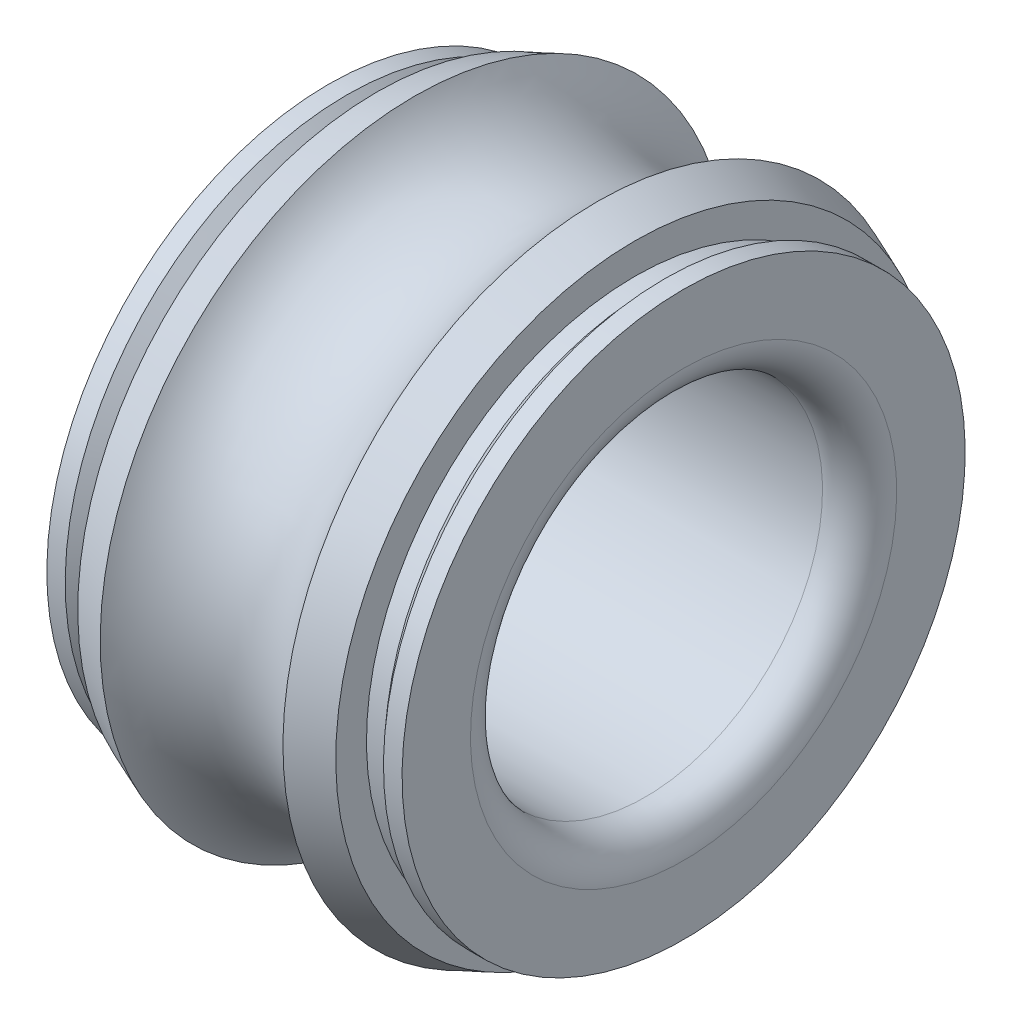
ISO-10303-21;
HEADER;
FILE_DESCRIPTION(('STEP AP214'),'2;1');
FILE_NAME('part.step','',(''),(''),'','','');
FILE_SCHEMA(('AUTOMOTIVE_DESIGN { 1 0 10303 214 1 1 1 1 }'));
ENDSEC;
DATA;
#1=APPLICATION_CONTEXT('core data for automotive mechanical design processes');
#2=APPLICATION_PROTOCOL_DEFINITION('international standard','automotive_design',2000,#1);
#3=PRODUCT_CONTEXT('',#1,'mechanical');
#4=PRODUCT('Part','Part','',(#3));
#5=PRODUCT_RELATED_PRODUCT_CATEGORY('part','',(#4));
#6=PRODUCT_DEFINITION_FORMATION('','',#4);
#7=PRODUCT_DEFINITION_CONTEXT('part definition',#1,'design');
#8=PRODUCT_DEFINITION('design','',#6,#7);
#9=PRODUCT_DEFINITION_SHAPE('','',#8);
#10=(LENGTH_UNIT() NAMED_UNIT(*) SI_UNIT(.MILLI.,.METRE.));
#11=(NAMED_UNIT(*) PLANE_ANGLE_UNIT() SI_UNIT($,.RADIAN.));
#12=(NAMED_UNIT(*) SI_UNIT($,.STERADIAN.) SOLID_ANGLE_UNIT());
#13=UNCERTAINTY_MEASURE_WITH_UNIT(LENGTH_MEASURE(1.E-05),#10,'distance_accuracy_value','');
#14=(GEOMETRIC_REPRESENTATION_CONTEXT(3) GLOBAL_UNCERTAINTY_ASSIGNED_CONTEXT((#13)) GLOBAL_UNIT_ASSIGNED_CONTEXT((#10,
#11,#12)) REPRESENTATION_CONTEXT('',''));
#15=CARTESIAN_POINT('',(0.,0.,0.));
#16=DIRECTION('',(0.,0.,1.));
#17=DIRECTION('',(1.,0.,0.));
#18=AXIS2_PLACEMENT_3D('',#15,#16,#17);
#19=CARTESIAN_POINT('',(2.0012061303941,0.00229086451254343,0.));
#20=DIRECTION('',(0.999999919699005,0.000400751771926105,0.));
#21=DIRECTION('',(-0.000400751771926105,0.999999919699005,0.));
#22=AXIS2_PLACEMENT_3D('',#19,#20,#21);
#23=TOROIDAL_SURFACE('',#22,2.99734814400219,0.500000000000002);
#24=CARTESIAN_POINT('',(2.50120200279558,0.00249123876045439,0.));
#25=DIRECTION('',(0.999999919699005,0.000400751771926105,0.));
#26=DIRECTION('',(-0.000400751771926105,0.999999919699005,0.));
#27=AXIS2_PLACEMENT_3D('',#24,#25,#26);
#28=CIRCLE('',#27,2.99936988375997);
#29=CARTESIAN_POINT('',(2.5,3.00186088166804,0.));
#30=VERTEX_POINT('',#29);
#31=EDGE_CURVE('E10',#30,#30,#28,.T.);
#32=ORIENTED_EDGE('',*,*,#31,.T.);
#33=EDGE_LOOP('',(#32));
#34=FACE_BOUND('',#33,.T.);
#35=CARTESIAN_POINT('',(1.95803340878141,0.00227356296646902,0.));
#36=DIRECTION('',(0.999999919699005,0.000400751771926105,0.));
#37=DIRECTION('',(-0.000400751771926105,0.999999919699005,0.));
#38=AXIS2_PLACEMENT_3D('',#35,#36,#37);
#39=CIRCLE('',#38,2.49921551526842);
#40=CARTESIAN_POINT('',(1.95703184373524,2.5014888775454,0.));
#41=VERTEX_POINT('',#40);
#42=EDGE_CURVE('E104',#41,#41,#39,.T.);
#43=ORIENTED_EDGE('',*,*,#42,.F.);
#44=EDGE_LOOP('',(#43));
#45=FACE_BOUND('',#44,.T.);
#46=ADVANCED_FACE('F37',(#34,#45),#23,.T.);
#47=CARTESIAN_POINT('',(2.50120200279558,0.00249123876045439,0.));
#48=DIRECTION('',(0.999999919699005,0.000400751771926105,0.));
#49=DIRECTION('',(-0.000400751771926105,0.999999919699005,0.));
#50=AXIS2_PLACEMENT_3D('',#47,#48,#49);
#51=CONICAL_SURFACE('',#50,2.99936988375997,1.57039557501224);
#52=CARTESIAN_POINT('',(2.50158800400865,0.00249139345113691,0.));
#53=DIRECTION('',(0.999999919699005,0.000400751771926105,0.));
#54=DIRECTION('',(-0.000400751771926105,0.999999919699005,0.));
#55=AXIS2_PLACEMENT_3D('',#52,#53,#54);
#56=CIRCLE('',#55,3.96256266320082);
#57=CARTESIAN_POINT('',(2.5,3.96505373845423,0.));
#58=VERTEX_POINT('',#57);
#59=EDGE_CURVE('E44',#58,#58,#56,.T.);
#60=ORIENTED_EDGE('',*,*,#59,.T.);
#61=EDGE_LOOP('',(#60));
#62=FACE_BOUND('',#61,.T.);
#63=ORIENTED_EDGE('',*,*,#31,.F.);
#64=EDGE_LOOP('',(#63));
#65=FACE_BOUND('',#64,.T.);
#66=ADVANCED_FACE('F113',(#62,#65),#51,.F.);
#67=CARTESIAN_POINT('',(2.50158800400865,0.00249139345113691,0.));
#68=DIRECTION('',(-0.999999919699005,-0.000400751771926105,0.));
#69=DIRECTION('',(0.000400751771926105,-0.999999919699005,0.));
#70=AXIS2_PLACEMENT_3D('',#67,#68,#69);
#71=CONICAL_SURFACE('',#70,3.96256266320082,0.000400751782648256);
#72=CARTESIAN_POINT('',(2.24002047579692,0.00238656979231029,0.));
#73=DIRECTION('',(0.999999919699005,0.000400751771926105,0.));
#74=DIRECTION('',(-0.000400751771926105,0.999999919699005,0.));
#75=AXIS2_PLACEMENT_3D('',#72,#73,#74);
#76=CIRCLE('',#75,3.96266748686806);
#77=CARTESIAN_POINT('',(2.23843242978001,3.96505373845423,0.));
#78=VERTEX_POINT('',#77);
#79=EDGE_CURVE('E50',#78,#78,#76,.T.);
#80=ORIENTED_EDGE('',*,*,#79,.T.);
#81=EDGE_LOOP('',(#80));
#82=FACE_BOUND('',#81,.T.);
#83=ORIENTED_EDGE('',*,*,#59,.F.);
#84=EDGE_LOOP('',(#83));
#85=FACE_BOUND('',#84,.T.);
#86=ADVANCED_FACE('F117',(#82,#85),#71,.T.);
#87=CARTESIAN_POINT('',(2.24002047579692,0.00238656979231029,0.));
#88=DIRECTION('',(0.999999919699005,0.000400751771926105,0.));
#89=DIRECTION('',(-0.000400751771926105,0.999999919699005,0.));
#90=AXIS2_PLACEMENT_3D('',#87,#88,#89);
#91=CONICAL_SURFACE('',#90,3.96266748686806,0.840613285944387);
#92=CARTESIAN_POINT('',(2.07467902643749,0.00232030890818585,0.));
#93=DIRECTION('',(0.999999919699005,0.000400751771926105,0.));
#94=DIRECTION('',(-0.000400751771926105,0.999999919699005,0.));
#95=AXIS2_PLACEMENT_3D('',#92,#93,#94);
#96=CIRCLE('',#95,3.77797943710241);
#97=CARTESIAN_POINT('',(2.07316499448377,3.78029944263509,0.));
#98=VERTEX_POINT('',#97);
#99=EDGE_CURVE('E55',#98,#98,#96,.T.);
#100=ORIENTED_EDGE('',*,*,#99,.T.);
#101=EDGE_LOOP('',(#100));
#102=FACE_BOUND('',#101,.T.);
#103=ORIENTED_EDGE('',*,*,#79,.F.);
#104=EDGE_LOOP('',(#103));
#105=FACE_BOUND('',#104,.T.);
#106=ADVANCED_FACE('F121',(#102,#105),#91,.T.);
#107=CARTESIAN_POINT('',(2.07467902643749,0.00232030890818585,0.));
#108=DIRECTION('',(-0.999999919699005,-0.000400751771926105,0.));
#109=DIRECTION('',(0.000400751771926105,-0.999999919699005,0.));
#110=AXIS2_PLACEMENT_3D('',#107,#108,#109);
#111=CONICAL_SURFACE('',#110,3.77797943710241,0.000400751782654951);
#112=CARTESIAN_POINT('',(1.81613780415395,0.00221669804691973,0.));
#113=DIRECTION('',(0.999999919699005,0.000400751771926105,0.));
#114=DIRECTION('',(-0.000400751771926105,0.999999919699005,0.));
#115=AXIS2_PLACEMENT_3D('',#112,#113,#114);
#116=CIRCLE('',#115,3.778083047972);
#117=CARTESIAN_POINT('',(1.81462373067799,3.78029944263509,0.));
#118=VERTEX_POINT('',#117);
#119=EDGE_CURVE('E61',#118,#118,#116,.T.);
#120=ORIENTED_EDGE('',*,*,#119,.T.);
#121=EDGE_LOOP('',(#120));
#122=FACE_BOUND('',#121,.T.);
#123=ORIENTED_EDGE('',*,*,#99,.F.);
#124=EDGE_LOOP('',(#123));
#125=FACE_BOUND('',#124,.T.);
#126=ADVANCED_FACE('F128',(#122,#125),#111,.T.);
#127=CARTESIAN_POINT('',(1.81613780415395,0.00221669804691973,0.));
#128=DIRECTION('',(0.999999919699005,0.000400751771926105,0.));
#129=DIRECTION('',(-0.000400751771926105,0.999999919699005,0.));
#130=AXIS2_PLACEMENT_3D('',#127,#128,#129);
#131=CONICAL_SURFACE('',#130,3.778083047972,1.57039557501223);
#132=CARTESIAN_POINT('',(1.81631095809693,0.00221676743867477,0.));
#133=DIRECTION('',(0.999999919699005,0.000400751771926105,0.));
#134=DIRECTION('',(-0.000400751771926105,0.999999919699005,0.));
#135=AXIS2_PLACEMENT_3D('',#132,#133,#134);
#136=CIRCLE('',#135,4.2101558549054);
#137=CARTESIAN_POINT('',(1.81462373067799,4.21237228426437,0.));
#138=VERTEX_POINT('',#137);
#139=EDGE_CURVE('E65',#138,#138,#136,.T.);
#140=ORIENTED_EDGE('',*,*,#139,.T.);
#141=EDGE_LOOP('',(#140));
#142=FACE_BOUND('',#141,.T.);
#143=ORIENTED_EDGE('',*,*,#119,.F.);
#144=EDGE_LOOP('',(#143));
#145=FACE_BOUND('',#144,.T.);
#146=ADVANCED_FACE('F132',(#142,#145),#131,.F.);
#147=CARTESIAN_POINT('',(1.81631095809693,0.00221676743867477,0.));
#148=DIRECTION('',(-0.999999919699005,-0.000400751771926105,0.));
#149=DIRECTION('',(0.000400751771926105,-0.999999919699005,0.));
#150=AXIS2_PLACEMENT_3D('',#147,#148,#149);
#151=CONICAL_SURFACE('',#150,4.2101558549054,0.384415956478727);
#152=CARTESIAN_POINT('',(1.28692066487055,0.00200461332358763,0.));
#153=DIRECTION('',(0.999999919699005,0.000400751771926105,0.));
#154=DIRECTION('',(-0.000400751771926105,0.999999919699005,0.));
#155=AXIS2_PLACEMENT_3D('',#152,#153,#154);
#156=CIRCLE('',#155,4.42431660636691);
#157=CARTESIAN_POINT('',(1.28514761215099,4.42632086441348,0.));
#158=VERTEX_POINT('',#157);
#159=EDGE_CURVE('E69',#158,#158,#156,.T.);
#160=ORIENTED_EDGE('',*,*,#159,.T.);
#161=EDGE_LOOP('',(#160));
#162=FACE_BOUND('',#161,.T.);
#163=ORIENTED_EDGE('',*,*,#139,.F.);
#164=EDGE_LOOP('',(#163));
#165=FACE_BOUND('',#164,.T.);
#166=ADVANCED_FACE('F136',(#162,#165),#151,.T.);
#167=CARTESIAN_POINT('',(0.00208326477285036,0.00148971241751422,0.));
#168=DIRECTION('',(0.999999919699005,0.000400751771926105,0.));
#169=DIRECTION('',(-0.000400751771926105,0.999999919699005,0.));
#170=AXIS2_PLACEMENT_3D('',#167,#168,#169);
#171=TOROIDAL_SURFACE('',#170,5.19839191936122,1.5);
#172=ORIENTED_EDGE('',*,*,#159,.F.);
#173=EDGE_LOOP('',(#172));
#174=FACE_BOUND('',#173,.T.);
#175=CARTESIAN_POINT('',(-1.28337414663692,0.000974563040789473,0.));
#176=DIRECTION('',(0.999999919699005,0.000400751771926105,0.));
#177=DIRECTION('',(-0.000400751771926105,0.999999919699005,0.));
#178=AXIS2_PLACEMENT_3D('',#175,#176,#177);
#179=CIRCLE('',#178,4.42534665673243);
#180=CARTESIAN_POINT('',(-1.28514761215099,4.42632086441348,0.));
#181=VERTEX_POINT('',#180);
#182=EDGE_CURVE('E73',#181,#181,#179,.T.);
#183=ORIENTED_EDGE('',*,*,#182,.T.);
#184=EDGE_LOOP('',(#183));
#185=FACE_BOUND('',#184,.T.);
#186=ADVANCED_FACE('F140',(#174,#185),#171,.F.);
#187=CARTESIAN_POINT('',(-1.8129359203947,0.000762340204570004,0.));
#188=DIRECTION('',(0.999999919699005,0.000400751771926105,0.));
#189=DIRECTION('',(-0.000400751771926105,0.999999919699005,0.));
#190=AXIS2_PLACEMENT_3D('',#187,#188,#189);
#191=CONICAL_SURFACE('',#190,4.2116102822563,0.38361445291344);
#192=ORIENTED_EDGE('',*,*,#182,.F.);
#193=EDGE_LOOP('',(#192));
#194=FACE_BOUND('',#193,.T.);
#195=CARTESIAN_POINT('',(-1.8129359203947,0.000762340204570004,0.));
#196=DIRECTION('',(0.999999919699005,0.000400751771926105,0.));
#197=DIRECTION('',(-0.000400751771926105,0.999999919699005,0.));
#198=AXIS2_PLACEMENT_3D('',#195,#196,#197);
#199=CIRCLE('',#198,4.2116102822563);
#200=CARTESIAN_POINT('',(-1.81462373067798,4.21237228426437,0.));
#201=VERTEX_POINT('',#200);
#202=EDGE_CURVE('E77',#201,#201,#199,.T.);
#203=ORIENTED_EDGE('',*,*,#202,.T.);
#204=EDGE_LOOP('',(#203));
#205=FACE_BOUND('',#204,.T.);
#206=ADVANCED_FACE('F144',(#194,#205),#191,.T.);
#207=CARTESIAN_POINT('',(-1.81310907433769,0.000762270812814965,0.));
#208=DIRECTION('',(0.999999919699005,0.000400751771926105,0.));
#209=DIRECTION('',(-0.000400751771926105,0.999999919699005,0.));
#210=AXIS2_PLACEMENT_3D('',#207,#208,#209);
#211=CONICAL_SURFACE('',#210,3.7795374753229,1.57039557501223);
#212=ORIENTED_EDGE('',*,*,#202,.F.);
#213=EDGE_LOOP('',(#212));
#214=FACE_BOUND('',#213,.T.);
#215=CARTESIAN_POINT('',(-1.81310907433769,0.000762270812814965,0.));
#216=DIRECTION('',(0.999999919699005,0.000400751771926105,0.));
#217=DIRECTION('',(-0.000400751771926105,0.999999919699005,0.));
#218=AXIS2_PLACEMENT_3D('',#215,#216,#217);
#219=CIRCLE('',#218,3.7795374753229);
#220=CARTESIAN_POINT('',(-1.81462373067799,3.78029944263509,0.));
#221=VERTEX_POINT('',#220);
#222=EDGE_CURVE('E81',#221,#221,#219,.T.);
#223=ORIENTED_EDGE('',*,*,#222,.T.);
#224=EDGE_LOOP('',(#223));
#225=FACE_BOUND('',#224,.T.);
#226=ADVANCED_FACE('F148',(#214,#225),#211,.T.);
#227=CARTESIAN_POINT('',(-2.07165029662124,0.000658659951548837,0.));
#228=DIRECTION('',(-0.999999919699005,-0.000400751771926105,0.));
#229=DIRECTION('',(0.000400751771926105,-0.999999919699005,0.));
#230=AXIS2_PLACEMENT_3D('',#227,#228,#229);
#231=CONICAL_SURFACE('',#230,3.77964108619248,0.00040075178264824);
#232=ORIENTED_EDGE('',*,*,#222,.F.);
#233=EDGE_LOOP('',(#232));
#234=FACE_BOUND('',#233,.T.);
#235=CARTESIAN_POINT('',(-2.07165029662124,0.000658659951548837,0.));
#236=DIRECTION('',(0.999999919699005,0.000400751771926105,0.));
#237=DIRECTION('',(-0.000400751771926105,0.999999919699005,0.));
#238=AXIS2_PLACEMENT_3D('',#235,#236,#237);
#239=CIRCLE('',#238,3.77964108619248);
#240=CARTESIAN_POINT('',(-2.07316499448377,3.78029944263509,0.));
#241=VERTEX_POINT('',#240);
#242=EDGE_CURVE('E85',#241,#241,#239,.T.);
#243=ORIENTED_EDGE('',*,*,#242,.T.);
#244=EDGE_LOOP('',(#243));
#245=FACE_BOUND('',#244,.T.);
#246=ADVANCED_FACE('F152',(#234,#245),#231,.T.);
#247=CARTESIAN_POINT('',(-2.23684366476972,0.000592458411236842,0.));
#248=DIRECTION('',(-0.999999919699005,-0.000400751771926105,0.));
#249=DIRECTION('',(0.000400751771926105,-0.999999919699005,0.));
#250=AXIS2_PLACEMENT_3D('',#247,#248,#249);
#251=CONICAL_SURFACE('',#250,3.9644615983932,0.841414789509694);
#252=ORIENTED_EDGE('',*,*,#242,.F.);
#253=EDGE_LOOP('',(#252));
#254=FACE_BOUND('',#253,.T.);
#255=CARTESIAN_POINT('',(-2.23684366476972,0.000592458411236842,0.));
#256=DIRECTION('',(0.999999919699005,0.000400751771926105,0.));
#257=DIRECTION('',(-0.000400751771926105,0.999999919699005,0.));
#258=AXIS2_PLACEMENT_3D('',#255,#256,#257);
#259=CIRCLE('',#258,3.9644615983932);
#260=CARTESIAN_POINT('',(-2.23843242978001,3.96505373845423,0.));
#261=VERTEX_POINT('',#260);
#262=EDGE_CURVE('E89',#261,#261,#259,.T.);
#263=ORIENTED_EDGE('',*,*,#262,.T.);
#264=EDGE_LOOP('',(#263));
#265=FACE_BOUND('',#264,.T.);
#266=ADVANCED_FACE('F156',(#254,#265),#251,.T.);
#267=CARTESIAN_POINT('',(-2.49527353884344,0.000488892172966687,0.));
#268=DIRECTION('',(-0.999999919699005,-0.000400751771926105,0.));
#269=DIRECTION('',(0.000400751771926105,-0.999999919699005,0.));
#270=AXIS2_PLACEMENT_3D('',#267,#268,#269);
#271=CONICAL_SURFACE('',#270,3.96456516463979,0.000400751782649204);
#272=ORIENTED_EDGE('',*,*,#262,.F.);
#273=EDGE_LOOP('',(#272));
#274=FACE_BOUND('',#273,.T.);
#275=CARTESIAN_POINT('',(-2.49527353884344,0.000488892172966687,0.));
#276=DIRECTION('',(0.999999919699005,0.000400751771926105,0.));
#277=DIRECTION('',(-0.000400751771926105,0.999999919699005,0.));
#278=AXIS2_PLACEMENT_3D('',#275,#276,#277);
#279=CIRCLE('',#278,3.96456516463979);
#280=CARTESIAN_POINT('',(-2.49686234535808,3.96505373845423,0.));
#281=VERTEX_POINT('',#280);
#282=EDGE_CURVE('E93',#281,#281,#279,.T.);
#283=ORIENTED_EDGE('',*,*,#282,.T.);
#284=EDGE_LOOP('',(#283));
#285=FACE_BOUND('',#284,.T.);
#286=ADVANCED_FACE('F160',(#274,#285),#271,.T.);
#287=CARTESIAN_POINT('',(-2.49565954005651,0.000488737482284163,0.));
#288=DIRECTION('',(0.999999919699005,0.000400751771926105,0.));
#289=DIRECTION('',(-0.000400751771926105,0.999999919699005,0.));
#290=AXIS2_PLACEMENT_3D('',#287,#288,#289);
#291=CONICAL_SURFACE('',#290,3.00137238519894,1.57039557501224);
#292=ORIENTED_EDGE('',*,*,#282,.F.);
#293=EDGE_LOOP('',(#292));
#294=FACE_BOUND('',#293,.T.);
#295=CARTESIAN_POINT('',(-2.49565954005651,0.000488737482284163,0.));
#296=DIRECTION('',(0.999999919699005,0.000400751771926105,0.));
#297=DIRECTION('',(-0.000400751771926105,0.999999919699005,0.));
#298=AXIS2_PLACEMENT_3D('',#295,#296,#297);
#299=CIRCLE('',#298,3.00137238519894);
#300=CARTESIAN_POINT('',(-2.49686234535808,3.00186088166804,0.));
#301=VERTEX_POINT('',#300);
#302=EDGE_CURVE('E97',#301,#301,#299,.T.);
#303=ORIENTED_EDGE('',*,*,#302,.T.);
#304=EDGE_LOOP('',(#303));
#305=FACE_BOUND('',#304,.T.);
#306=ADVANCED_FACE('F164',(#294,#305),#291,.T.);
#307=CARTESIAN_POINT('',(-1.99565994110063,0.000689113223618313,0.));
#308=DIRECTION('',(0.999999919699005,0.000400751771926105,0.));
#309=DIRECTION('',(-0.000400751771926105,0.999999919699005,0.));
#310=AXIS2_PLACEMENT_3D('',#307,#308,#309);
#311=TOROIDAL_SURFACE('',#310,3.00071697439448,0.500000068669789);
#312=ORIENTED_EDGE('',*,*,#302,.F.);
#313=EDGE_LOOP('',(#312));
#314=FACE_BOUND('',#313,.T.);
#315=CARTESIAN_POINT('',(-1.98674476742788,0.000692685995551722,0.));
#316=DIRECTION('',(0.999999919699005,0.000400751771926105,0.));
#317=DIRECTION('',(-0.000400751771926105,0.999999919699005,0.));
#318=AXIS2_PLACEMENT_3D('',#315,#316,#317);
#319=CIRCLE('',#318,2.50079639236628);
#320=CARTESIAN_POINT('',(-1.98774696601335,2.5014888775454,0.));
#321=VERTEX_POINT('',#320);
#322=EDGE_CURVE('E101',#321,#321,#319,.T.);
#323=ORIENTED_EDGE('',*,*,#322,.T.);
#324=EDGE_LOOP('',(#323));
#325=FACE_BOUND('',#324,.T.);
#326=ADVANCED_FACE('F168',(#314,#325),#311,.T.);
#327=CARTESIAN_POINT('',(-1.98674476742788,0.000692685995551722,0.));
#328=DIRECTION('',(-0.999999919699005,-0.000400751771926105,0.));
#329=DIRECTION('',(0.000400751771926105,-0.999999919699005,0.));
#330=AXIS2_PLACEMENT_3D('',#327,#328,#329);
#331=CONICAL_SURFACE('',#330,2.50079639236628,0.000400751782653123);
#332=ORIENTED_EDGE('',*,*,#42,.T.);
#333=EDGE_LOOP('',(#332));
#334=FACE_BOUND('',#333,.T.);
#335=ORIENTED_EDGE('',*,*,#322,.F.);
#336=EDGE_LOOP('',(#335));
#337=FACE_BOUND('',#336,.T.);
#338=ADVANCED_FACE('F109',(#334,#337),#331,.F.);
#339=CLOSED_SHELL('',(#46,#66,#86,#106,#126,#146,#166,#186,#206,#226,#246,#266,#286,#306,#326,#338));
#340=MANIFOLD_SOLID_BREP('B2',#339);
#341=ADVANCED_BREP_SHAPE_REPRESENTATION('',(#18,#340),#14);
#342=SHAPE_DEFINITION_REPRESENTATION(#9,#341);
ENDSEC;
END-ISO-10303-21;
